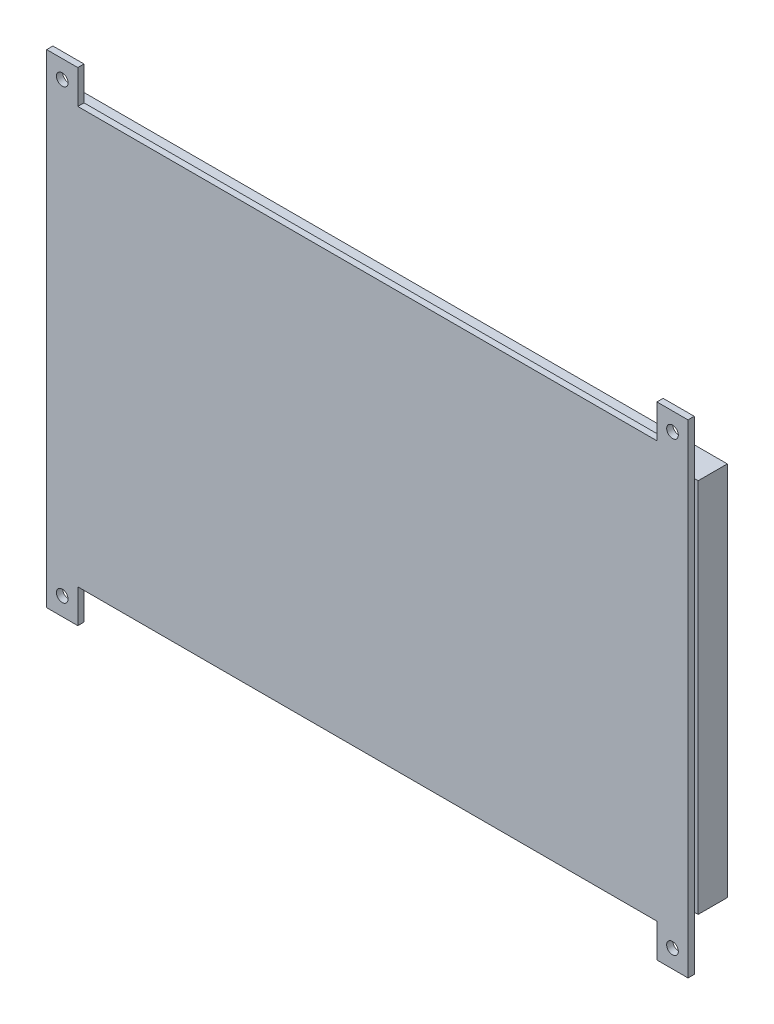
ISO-10303-21;
HEADER;
FILE_DESCRIPTION(('STEP AP214'),'2;1');
FILE_NAME('part.step','',(''),(''),'','','');
FILE_SCHEMA(('AUTOMOTIVE_DESIGN { 1 0 10303 214 1 1 1 1 }'));
ENDSEC;
DATA;
#1=APPLICATION_CONTEXT('core data for automotive mechanical design processes');
#2=APPLICATION_PROTOCOL_DEFINITION('international standard','automotive_design',2000,#1);
#3=PRODUCT_CONTEXT('',#1,'mechanical');
#4=PRODUCT('Part','Part','',(#3));
#5=PRODUCT_RELATED_PRODUCT_CATEGORY('part','',(#4));
#6=PRODUCT_DEFINITION_FORMATION('','',#4);
#7=PRODUCT_DEFINITION_CONTEXT('part definition',#1,'design');
#8=PRODUCT_DEFINITION('design','',#6,#7);
#9=PRODUCT_DEFINITION_SHAPE('','',#8);
#10=(LENGTH_UNIT() NAMED_UNIT(*) SI_UNIT(.MILLI.,.METRE.));
#11=(NAMED_UNIT(*) PLANE_ANGLE_UNIT() SI_UNIT($,.RADIAN.));
#12=(NAMED_UNIT(*) SI_UNIT($,.STERADIAN.) SOLID_ANGLE_UNIT());
#13=UNCERTAINTY_MEASURE_WITH_UNIT(LENGTH_MEASURE(1.E-05),#10,'distance_accuracy_value','');
#14=(GEOMETRIC_REPRESENTATION_CONTEXT(3) GLOBAL_UNCERTAINTY_ASSIGNED_CONTEXT((#13)) GLOBAL_UNIT_ASSIGNED_CONTEXT((#10,
#11,#12)) REPRESENTATION_CONTEXT('',''));
#15=CARTESIAN_POINT('',(0.,0.,0.));
#16=DIRECTION('',(0.,0.,1.));
#17=DIRECTION('',(1.,0.,0.));
#18=AXIS2_PLACEMENT_3D('',#15,#16,#17);
#19=CARTESIAN_POINT('',(-78.45,43.2869206573995,-7.5));
#20=DIRECTION('',(1.,0.,0.));
#21=DIRECTION('',(0.,1.,0.));
#22=AXIS2_PLACEMENT_3D('',#19,#20,#21);
#23=PLANE('',#22);
#24=DIRECTION('',(0.,0.,1.));
#25=VECTOR('',#24,1.);
#26=CARTESIAN_POINT('',(-78.45,43.2869206573995,-7.5));
#27=LINE('',#26,#25);
#28=CARTESIAN_POINT('',(-78.45,43.2869206573995,-7.5));
#29=VERTEX_POINT('',#28);
#30=CARTESIAN_POINT('',(-78.45,43.2869206573995,-4.));
#31=VERTEX_POINT('',#30);
#32=EDGE_CURVE('E195',#29,#31,#27,.T.);
#33=ORIENTED_EDGE('',*,*,#32,.T.);
#34=DIRECTION('',(0.,1.,0.));
#35=VECTOR('',#34,1.);
#36=CARTESIAN_POINT('',(-78.45,-43.2869206573995,-4.));
#37=LINE('',#36,#35);
#38=CARTESIAN_POINT('',(-78.45,-43.2869206573995,-4.));
#39=VERTEX_POINT('',#38);
#40=EDGE_CURVE('E181',#39,#31,#37,.T.);
#41=ORIENTED_EDGE('',*,*,#40,.F.);
#42=DIRECTION('',(0.,0.,1.));
#43=VECTOR('',#42,1.);
#44=CARTESIAN_POINT('',(-78.45,-43.2869206573995,-7.5));
#45=LINE('',#44,#43);
#46=CARTESIAN_POINT('',(-78.45,-43.2869206573995,-7.5));
#47=VERTEX_POINT('',#46);
#48=EDGE_CURVE('E624',#47,#39,#45,.T.);
#49=ORIENTED_EDGE('',*,*,#48,.F.);
#50=DIRECTION('',(0.,1.,0.));
#51=VECTOR('',#50,1.);
#52=CARTESIAN_POINT('',(-78.45,43.2869206573995,-7.5));
#53=LINE('',#52,#51);
#54=EDGE_CURVE('E201',#47,#29,#53,.T.);
#55=ORIENTED_EDGE('',*,*,#54,.T.);
#56=EDGE_LOOP('',(#33,#41,#49,#55));
#57=FACE_BOUND('',#56,.T.);
#58=ADVANCED_FACE('F32',(#57),#23,.T.);
#59=CARTESIAN_POINT('',(78.45,43.2869206573995,-7.5));
#60=DIRECTION('',(0.,-1.,0.));
#61=DIRECTION('',(0.,0.,-1.));
#62=AXIS2_PLACEMENT_3D('',#59,#60,#61);
#63=PLANE('',#62);
#64=DIRECTION('',(0.,0.,1.));
#65=VECTOR('',#64,1.);
#66=CARTESIAN_POINT('',(78.45,43.2869206573995,-7.5));
#67=LINE('',#66,#65);
#68=CARTESIAN_POINT('',(78.45,43.2869206573995,-7.5));
#69=VERTEX_POINT('',#68);
#70=CARTESIAN_POINT('',(78.45,43.2869206573995,-4.));
#71=VERTEX_POINT('',#70);
#72=EDGE_CURVE('E198',#69,#71,#67,.T.);
#73=ORIENTED_EDGE('',*,*,#72,.T.);
#74=DIRECTION('',(1.,0.,0.));
#75=VECTOR('',#74,1.);
#76=CARTESIAN_POINT('',(78.45,43.2869206573995,-4.));
#77=LINE('',#76,#75);
#78=EDGE_CURVE('E184',#31,#71,#77,.T.);
#79=ORIENTED_EDGE('',*,*,#78,.F.);
#80=ORIENTED_EDGE('',*,*,#32,.F.);
#81=DIRECTION('',(1.,0.,0.));
#82=VECTOR('',#81,1.);
#83=CARTESIAN_POINT('',(78.45,43.2869206573995,-7.5));
#84=LINE('',#83,#82);
#85=EDGE_CURVE('E630',#29,#69,#84,.T.);
#86=ORIENTED_EDGE('',*,*,#85,.T.);
#87=EDGE_LOOP('',(#73,#79,#80,#86));
#88=FACE_BOUND('',#87,.T.);
#89=ADVANCED_FACE('F194',(#88),#63,.T.);
#90=CARTESIAN_POINT('',(78.45,43.2869206573995,-7.5));
#91=DIRECTION('',(-1.,0.,0.));
#92=DIRECTION('',(0.,-1.,0.));
#93=AXIS2_PLACEMENT_3D('',#90,#91,#92);
#94=PLANE('',#93);
#95=DIRECTION('',(0.,0.,1.));
#96=VECTOR('',#95,1.);
#97=CARTESIAN_POINT('',(78.45,-43.2869206573995,-7.5));
#98=LINE('',#97,#96);
#99=CARTESIAN_POINT('',(78.45,-43.2869206573995,-7.5));
#100=VERTEX_POINT('',#99);
#101=CARTESIAN_POINT('',(78.45,-43.2869206573995,-4.));
#102=VERTEX_POINT('',#101);
#103=EDGE_CURVE('E207',#100,#102,#98,.T.);
#104=ORIENTED_EDGE('',*,*,#103,.T.);
#105=DIRECTION('',(0.,-1.,0.));
#106=VECTOR('',#105,1.);
#107=CARTESIAN_POINT('',(78.45,-43.2869206573995,-4.));
#108=LINE('',#107,#106);
#109=EDGE_CURVE('E51',#71,#102,#108,.T.);
#110=ORIENTED_EDGE('',*,*,#109,.F.);
#111=ORIENTED_EDGE('',*,*,#72,.F.);
#112=DIRECTION('',(0.,-1.,0.));
#113=VECTOR('',#112,1.);
#114=CARTESIAN_POINT('',(78.45,43.2869206573995,-7.5));
#115=LINE('',#114,#113);
#116=EDGE_CURVE('E622',#69,#100,#115,.T.);
#117=ORIENTED_EDGE('',*,*,#116,.T.);
#118=EDGE_LOOP('',(#104,#110,#111,#117));
#119=FACE_BOUND('',#118,.T.);
#120=ADVANCED_FACE('F441',(#119),#94,.T.);
#121=CARTESIAN_POINT('',(78.45,-43.2869206573995,-7.5));
#122=DIRECTION('',(0.,1.,0.));
#123=DIRECTION('',(0.,0.,1.));
#124=AXIS2_PLACEMENT_3D('',#121,#122,#123);
#125=PLANE('',#124);
#126=ORIENTED_EDGE('',*,*,#48,.T.);
#127=DIRECTION('',(-1.,0.,0.));
#128=VECTOR('',#127,1.);
#129=CARTESIAN_POINT('',(78.45,-43.2869206573995,-4.));
#130=LINE('',#129,#128);
#131=EDGE_CURVE('E185',#102,#39,#130,.T.);
#132=ORIENTED_EDGE('',*,*,#131,.F.);
#133=ORIENTED_EDGE('',*,*,#103,.F.);
#134=DIRECTION('',(-1.,0.,0.));
#135=VECTOR('',#134,1.);
#136=CARTESIAN_POINT('',(78.45,-43.2869206573995,-7.5));
#137=LINE('',#136,#135);
#138=EDGE_CURVE('E625',#100,#47,#137,.T.);
#139=ORIENTED_EDGE('',*,*,#138,.T.);
#140=EDGE_LOOP('',(#126,#132,#133,#139));
#141=FACE_BOUND('',#140,.T.);
#142=ADVANCED_FACE('F478',(#141),#125,.T.);
#143=CARTESIAN_POINT('',(0.,0.,0.));
#144=DIRECTION('',(0.,0.,1.));
#145=DIRECTION('',(1.,0.,0.));
#146=AXIS2_PLACEMENT_3D('',#143,#144,#145);
#147=PLANE('',#146);
#148=CARTESIAN_POINT('',(78.45,57.48,0.));
#149=DIRECTION('',(0.,0.,1.));
#150=DIRECTION('',(1.,0.,0.));
#151=AXIS2_PLACEMENT_3D('',#148,#149,#150);
#152=CIRCLE('',#151,1.5);
#153=CARTESIAN_POINT('',(79.95,57.48,0.));
#154=VERTEX_POINT('',#153);
#155=EDGE_CURVE('E254',#154,#154,#152,.T.);
#156=ORIENTED_EDGE('',*,*,#155,.T.);
#157=EDGE_LOOP('',(#156));
#158=FACE_BOUND('',#157,.T.);
#159=CARTESIAN_POINT('',(-78.45,57.48,0.));
#160=DIRECTION('',(0.,0.,1.));
#161=DIRECTION('',(1.,0.,0.));
#162=AXIS2_PLACEMENT_3D('',#159,#160,#161);
#163=CIRCLE('',#162,1.5);
#164=CARTESIAN_POINT('',(-76.95,57.48,0.));
#165=VERTEX_POINT('',#164);
#166=EDGE_CURVE('E248',#165,#165,#163,.T.);
#167=ORIENTED_EDGE('',*,*,#166,.T.);
#168=EDGE_LOOP('',(#167));
#169=FACE_BOUND('',#168,.T.);
#170=DIRECTION('',(1.,0.,0.));
#171=VECTOR('',#170,1.);
#172=CARTESIAN_POINT('',(83.45,48.2869206573995,0.));
#173=LINE('',#172,#171);
#174=CARTESIAN_POINT('',(-82.45,48.2869206573995,0.));
#175=VERTEX_POINT('',#174);
#176=CARTESIAN_POINT('',(82.45,48.2869206573995,0.));
#177=VERTEX_POINT('',#176);
#178=EDGE_CURVE('E11',#175,#177,#173,.T.);
#179=ORIENTED_EDGE('',*,*,#178,.F.);
#180=DIRECTION('',(0.,-1.,0.));
#181=VECTOR('',#180,1.);
#182=CARTESIAN_POINT('',(-82.45,-53.48,0.));
#183=LINE('',#182,#181);
#184=CARTESIAN_POINT('',(-82.45,62.135,0.));
#185=VERTEX_POINT('',#184);
#186=EDGE_CURVE('E302',#185,#175,#183,.T.);
#187=ORIENTED_EDGE('',*,*,#186,.F.);
#188=DIRECTION('',(-1.,0.,0.));
#189=VECTOR('',#188,1.);
#190=CARTESIAN_POINT('',(-82.45,62.135,0.));
#191=LINE('',#190,#189);
#192=CARTESIAN_POINT('',(-74.45,62.135,0.));
#193=VERTEX_POINT('',#192);
#194=EDGE_CURVE('E298',#193,#185,#191,.T.);
#195=ORIENTED_EDGE('',*,*,#194,.F.);
#196=DIRECTION('',(0.,1.,0.));
#197=VECTOR('',#196,1.);
#198=CARTESIAN_POINT('',(-74.45,53.48,0.));
#199=LINE('',#198,#197);
#200=CARTESIAN_POINT('',(-74.45,53.48,0.));
#201=VERTEX_POINT('',#200);
#202=EDGE_CURVE('E296',#201,#193,#199,.T.);
#203=ORIENTED_EDGE('',*,*,#202,.F.);
#204=DIRECTION('',(-1.,0.,0.));
#205=VECTOR('',#204,1.);
#206=CARTESIAN_POINT('',(-74.45,53.48,0.));
#207=LINE('',#206,#205);
#208=CARTESIAN_POINT('',(74.45,53.48,0.));
#209=VERTEX_POINT('',#208);
#210=EDGE_CURVE('E294',#209,#201,#207,.T.);
#211=ORIENTED_EDGE('',*,*,#210,.F.);
#212=DIRECTION('',(0.,-1.,0.));
#213=VECTOR('',#212,1.);
#214=CARTESIAN_POINT('',(74.45,53.48,0.));
#215=LINE('',#214,#213);
#216=CARTESIAN_POINT('',(74.45,62.135,0.));
#217=VERTEX_POINT('',#216);
#218=EDGE_CURVE('E292',#217,#209,#215,.T.);
#219=ORIENTED_EDGE('',*,*,#218,.F.);
#220=DIRECTION('',(-1.,0.,0.));
#221=VECTOR('',#220,1.);
#222=CARTESIAN_POINT('',(82.45,62.135,0.));
#223=LINE('',#222,#221);
#224=CARTESIAN_POINT('',(82.45,62.135,0.));
#225=VERTEX_POINT('',#224);
#226=EDGE_CURVE('E260',#225,#217,#223,.T.);
#227=ORIENTED_EDGE('',*,*,#226,.F.);
#228=DIRECTION('',(0.,1.,0.));
#229=VECTOR('',#228,1.);
#230=CARTESIAN_POINT('',(82.45,-53.48,0.));
#231=LINE('',#230,#229);
#232=EDGE_CURVE('E316',#177,#225,#231,.T.);
#233=ORIENTED_EDGE('',*,*,#232,.F.);
#234=EDGE_LOOP('',(#179,#187,#195,#203,#211,#219,#227,#233));
#235=FACE_BOUND('',#234,.T.);
#236=ADVANCED_FACE('F391',(#158,#169,#235),#147,.F.);
#237=CARTESIAN_POINT('',(-78.45,-57.48,0.));
#238=DIRECTION('',(0.,0.,1.));
#239=DIRECTION('',(-1.,0.,0.));
#240=AXIS2_PLACEMENT_3D('',#237,#238,#239);
#241=CIRCLE('',#240,1.5);
#242=CARTESIAN_POINT('',(-79.95,-57.48,0.));
#243=VERTEX_POINT('',#242);
#244=EDGE_CURVE('E242',#243,#243,#241,.T.);
#245=ORIENTED_EDGE('',*,*,#244,.T.);
#246=EDGE_LOOP('',(#245));
#247=FACE_BOUND('',#246,.T.);
#248=CARTESIAN_POINT('',(78.45,-57.48,0.));
#249=DIRECTION('',(0.,0.,1.));
#250=DIRECTION('',(-1.,0.,0.));
#251=AXIS2_PLACEMENT_3D('',#248,#249,#250);
#252=CIRCLE('',#251,1.5);
#253=CARTESIAN_POINT('',(76.95,-57.48,0.));
#254=VERTEX_POINT('',#253);
#255=EDGE_CURVE('E238',#254,#254,#252,.T.);
#256=ORIENTED_EDGE('',*,*,#255,.T.);
#257=EDGE_LOOP('',(#256));
#258=FACE_BOUND('',#257,.T.);
#259=DIRECTION('',(-1.,0.,0.));
#260=VECTOR('',#259,1.);
#261=CARTESIAN_POINT('',(83.45,-48.2869206573995,0.));
#262=LINE('',#261,#260);
#263=CARTESIAN_POINT('',(82.45,-48.2869206573995,0.));
#264=VERTEX_POINT('',#263);
#265=CARTESIAN_POINT('',(-82.45,-48.2869206573995,0.));
#266=VERTEX_POINT('',#265);
#267=EDGE_CURVE('E41',#264,#266,#262,.T.);
#268=ORIENTED_EDGE('',*,*,#267,.F.);
#269=CARTESIAN_POINT('',(82.45,-62.135,0.));
#270=VERTEX_POINT('',#269);
#271=EDGE_CURVE('E267',#270,#264,#231,.T.);
#272=ORIENTED_EDGE('',*,*,#271,.F.);
#273=DIRECTION('',(1.,0.,0.));
#274=VECTOR('',#273,1.);
#275=CARTESIAN_POINT('',(82.45,-62.135,0.));
#276=LINE('',#275,#274);
#277=CARTESIAN_POINT('',(74.45,-62.135,0.));
#278=VERTEX_POINT('',#277);
#279=EDGE_CURVE('E313',#278,#270,#276,.T.);
#280=ORIENTED_EDGE('',*,*,#279,.F.);
#281=DIRECTION('',(0.,-1.,0.));
#282=VECTOR('',#281,1.);
#283=CARTESIAN_POINT('',(74.45,-53.48,0.));
#284=LINE('',#283,#282);
#285=CARTESIAN_POINT('',(74.45,-53.48,0.));
#286=VERTEX_POINT('',#285);
#287=EDGE_CURVE('E311',#286,#278,#284,.T.);
#288=ORIENTED_EDGE('',*,*,#287,.F.);
#289=DIRECTION('',(1.,0.,0.));
#290=VECTOR('',#289,1.);
#291=CARTESIAN_POINT('',(-74.45,-53.48,0.));
#292=LINE('',#291,#290);
#293=CARTESIAN_POINT('',(-74.45,-53.48,0.));
#294=VERTEX_POINT('',#293);
#295=EDGE_CURVE('E309',#294,#286,#292,.T.);
#296=ORIENTED_EDGE('',*,*,#295,.F.);
#297=DIRECTION('',(0.,1.,0.));
#298=VECTOR('',#297,1.);
#299=CARTESIAN_POINT('',(-74.45,-53.48,0.));
#300=LINE('',#299,#298);
#301=CARTESIAN_POINT('',(-74.45,-62.135,0.));
#302=VERTEX_POINT('',#301);
#303=EDGE_CURVE('E307',#302,#294,#300,.T.);
#304=ORIENTED_EDGE('',*,*,#303,.F.);
#305=DIRECTION('',(1.,0.,0.));
#306=VECTOR('',#305,1.);
#307=CARTESIAN_POINT('',(-82.45,-62.135,0.));
#308=LINE('',#307,#306);
#309=CARTESIAN_POINT('',(-82.45,-62.135,0.));
#310=VERTEX_POINT('',#309);
#311=EDGE_CURVE('E304',#310,#302,#308,.T.);
#312=ORIENTED_EDGE('',*,*,#311,.F.);
#313=EDGE_CURVE('E301',#266,#310,#183,.T.);
#314=ORIENTED_EDGE('',*,*,#313,.F.);
#315=EDGE_LOOP('',(#268,#272,#280,#288,#296,#304,#312,#314));
#316=FACE_BOUND('',#315,.T.);
#317=ADVANCED_FACE('F408',(#247,#258,#316),#147,.F.);
#318=CARTESIAN_POINT('',(0.,0.,1.6));
#319=DIRECTION('',(0.,0.,1.));
#320=DIRECTION('',(1.,0.,0.));
#321=AXIS2_PLACEMENT_3D('',#318,#319,#320);
#322=PLANE('',#321);
#323=CARTESIAN_POINT('',(-78.45,-57.48,1.6));
#324=DIRECTION('',(0.,0.,1.));
#325=DIRECTION('',(-1.,0.,0.));
#326=AXIS2_PLACEMENT_3D('',#323,#324,#325);
#327=CIRCLE('',#326,1.5);
#328=CARTESIAN_POINT('',(-79.95,-57.48,1.6));
#329=VERTEX_POINT('',#328);
#330=EDGE_CURVE('E245',#329,#329,#327,.T.);
#331=ORIENTED_EDGE('',*,*,#330,.F.);
#332=EDGE_LOOP('',(#331));
#333=FACE_BOUND('',#332,.T.);
#334=CARTESIAN_POINT('',(78.45,57.48,1.6));
#335=DIRECTION('',(0.,0.,1.));
#336=DIRECTION('',(1.,0.,0.));
#337=AXIS2_PLACEMENT_3D('',#334,#335,#336);
#338=CIRCLE('',#337,1.5);
#339=CARTESIAN_POINT('',(79.95,57.48,1.6));
#340=VERTEX_POINT('',#339);
#341=EDGE_CURVE('E257',#340,#340,#338,.T.);
#342=ORIENTED_EDGE('',*,*,#341,.F.);
#343=EDGE_LOOP('',(#342));
#344=FACE_BOUND('',#343,.T.);
#345=DIRECTION('',(0.,1.,0.));
#346=VECTOR('',#345,1.);
#347=CARTESIAN_POINT('',(82.45,53.48,1.6));
#348=LINE('',#347,#346);
#349=CARTESIAN_POINT('',(82.45,-62.135,1.6));
#350=VERTEX_POINT('',#349);
#351=CARTESIAN_POINT('',(82.45,62.135,1.6));
#352=VERTEX_POINT('',#351);
#353=EDGE_CURVE('E263',#350,#352,#348,.T.);
#354=ORIENTED_EDGE('',*,*,#353,.T.);
#355=DIRECTION('',(-1.,0.,0.));
#356=VECTOR('',#355,1.);
#357=CARTESIAN_POINT('',(82.45,62.135,1.6));
#358=LINE('',#357,#356);
#359=CARTESIAN_POINT('',(74.45,62.135,1.6));
#360=VERTEX_POINT('',#359);
#361=EDGE_CURVE('E266',#352,#360,#358,.T.);
#362=ORIENTED_EDGE('',*,*,#361,.T.);
#363=DIRECTION('',(0.,-1.,0.));
#364=VECTOR('',#363,1.);
#365=CARTESIAN_POINT('',(74.45,53.48,1.6));
#366=LINE('',#365,#364);
#367=CARTESIAN_POINT('',(74.45,53.48,1.6));
#368=VERTEX_POINT('',#367);
#369=EDGE_CURVE('E269',#360,#368,#366,.T.);
#370=ORIENTED_EDGE('',*,*,#369,.T.);
#371=DIRECTION('',(-1.,0.,0.));
#372=VECTOR('',#371,1.);
#373=CARTESIAN_POINT('',(-74.45,53.48,1.6));
#374=LINE('',#373,#372);
#375=CARTESIAN_POINT('',(-74.45,53.48,1.6));
#376=VERTEX_POINT('',#375);
#377=EDGE_CURVE('E271',#368,#376,#374,.T.);
#378=ORIENTED_EDGE('',*,*,#377,.T.);
#379=DIRECTION('',(0.,1.,0.));
#380=VECTOR('',#379,1.);
#381=CARTESIAN_POINT('',(-74.45,53.48,1.6));
#382=LINE('',#381,#380);
#383=CARTESIAN_POINT('',(-74.45,62.135,1.6));
#384=VERTEX_POINT('',#383);
#385=EDGE_CURVE('E273',#376,#384,#382,.T.);
#386=ORIENTED_EDGE('',*,*,#385,.T.);
#387=DIRECTION('',(-1.,0.,0.));
#388=VECTOR('',#387,1.);
#389=CARTESIAN_POINT('',(-82.45,62.135,1.6));
#390=LINE('',#389,#388);
#391=CARTESIAN_POINT('',(-82.45,62.135,1.6));
#392=VERTEX_POINT('',#391);
#393=EDGE_CURVE('E275',#384,#392,#390,.T.);
#394=ORIENTED_EDGE('',*,*,#393,.T.);
#395=DIRECTION('',(0.,-1.,0.));
#396=VECTOR('',#395,1.);
#397=CARTESIAN_POINT('',(-82.45,53.48,1.6));
#398=LINE('',#397,#396);
#399=CARTESIAN_POINT('',(-82.45,-62.135,1.6));
#400=VERTEX_POINT('',#399);
#401=EDGE_CURVE('E277',#392,#400,#398,.T.);
#402=ORIENTED_EDGE('',*,*,#401,.T.);
#403=DIRECTION('',(1.,0.,0.));
#404=VECTOR('',#403,1.);
#405=CARTESIAN_POINT('',(-82.45,-62.135,1.6));
#406=LINE('',#405,#404);
#407=CARTESIAN_POINT('',(-74.45,-62.135,1.6));
#408=VERTEX_POINT('',#407);
#409=EDGE_CURVE('E279',#400,#408,#406,.T.);
#410=ORIENTED_EDGE('',*,*,#409,.T.);
#411=DIRECTION('',(0.,1.,0.));
#412=VECTOR('',#411,1.);
#413=CARTESIAN_POINT('',(-74.45,-53.48,1.6));
#414=LINE('',#413,#412);
#415=CARTESIAN_POINT('',(-74.45,-53.48,1.6));
#416=VERTEX_POINT('',#415);
#417=EDGE_CURVE('E281',#408,#416,#414,.T.);
#418=ORIENTED_EDGE('',*,*,#417,.T.);
#419=DIRECTION('',(1.,0.,0.));
#420=VECTOR('',#419,1.);
#421=CARTESIAN_POINT('',(-74.45,-53.48,1.6));
#422=LINE('',#421,#420);
#423=CARTESIAN_POINT('',(74.45,-53.48,1.6));
#424=VERTEX_POINT('',#423);
#425=EDGE_CURVE('E283',#416,#424,#422,.T.);
#426=ORIENTED_EDGE('',*,*,#425,.T.);
#427=DIRECTION('',(0.,-1.,0.));
#428=VECTOR('',#427,1.);
#429=CARTESIAN_POINT('',(74.45,-53.48,1.6));
#430=LINE('',#429,#428);
#431=CARTESIAN_POINT('',(74.45,-62.135,1.6));
#432=VERTEX_POINT('',#431);
#433=EDGE_CURVE('E285',#424,#432,#430,.T.);
#434=ORIENTED_EDGE('',*,*,#433,.T.);
#435=DIRECTION('',(1.,0.,0.));
#436=VECTOR('',#435,1.);
#437=CARTESIAN_POINT('',(82.45,-62.135,1.6));
#438=LINE('',#437,#436);
#439=EDGE_CURVE('E287',#432,#350,#438,.T.);
#440=ORIENTED_EDGE('',*,*,#439,.T.);
#441=EDGE_LOOP('',(#354,#362,#370,#378,#386,#394,#402,#410,#418,#426,#434,#440));
#442=FACE_BOUND('',#441,.T.);
#443=CARTESIAN_POINT('',(-78.45,57.48,1.6));
#444=DIRECTION('',(0.,0.,1.));
#445=DIRECTION('',(1.,0.,0.));
#446=AXIS2_PLACEMENT_3D('',#443,#444,#445);
#447=CIRCLE('',#446,1.5);
#448=CARTESIAN_POINT('',(-76.95,57.48,1.6));
#449=VERTEX_POINT('',#448);
#450=EDGE_CURVE('E251',#449,#449,#447,.T.);
#451=ORIENTED_EDGE('',*,*,#450,.F.);
#452=EDGE_LOOP('',(#451));
#453=FACE_BOUND('',#452,.T.);
#454=CARTESIAN_POINT('',(78.45,-57.48,1.6));
#455=DIRECTION('',(0.,0.,1.));
#456=DIRECTION('',(-1.,0.,0.));
#457=AXIS2_PLACEMENT_3D('',#454,#455,#456);
#458=CIRCLE('',#457,1.5);
#459=CARTESIAN_POINT('',(76.95,-57.48,1.6));
#460=VERTEX_POINT('',#459);
#461=EDGE_CURVE('E239',#460,#460,#458,.T.);
#462=ORIENTED_EDGE('',*,*,#461,.F.);
#463=EDGE_LOOP('',(#462));
#464=FACE_BOUND('',#463,.T.);
#465=ADVANCED_FACE('F397',(#333,#344,#442,#453,#464),#322,.T.);
#466=CARTESIAN_POINT('',(82.45,62.135,1.6));
#467=DIRECTION('',(0.,-1.,0.));
#468=DIRECTION('',(1.,0.,0.));
#469=AXIS2_PLACEMENT_3D('',#466,#467,#468);
#470=PLANE('',#469);
#471=ORIENTED_EDGE('',*,*,#226,.T.);
#472=DIRECTION('',(0.,0.,-1.));
#473=VECTOR('',#472,1.);
#474=CARTESIAN_POINT('',(74.45,62.135,1.6));
#475=LINE('',#474,#473);
#476=EDGE_CURVE('E348',#360,#217,#475,.T.);
#477=ORIENTED_EDGE('',*,*,#476,.F.);
#478=ORIENTED_EDGE('',*,*,#361,.F.);
#479=DIRECTION('',(0.,0.,-1.));
#480=VECTOR('',#479,1.);
#481=CARTESIAN_POINT('',(82.45,62.135,1.6));
#482=LINE('',#481,#480);
#483=EDGE_CURVE('E36',#352,#225,#482,.T.);
#484=ORIENTED_EDGE('',*,*,#483,.T.);
#485=EDGE_LOOP('',(#471,#477,#478,#484));
#486=FACE_BOUND('',#485,.T.);
#487=ADVANCED_FACE('F34',(#486),#470,.F.);
#488=CARTESIAN_POINT('',(74.45,53.48,1.6));
#489=DIRECTION('',(1.,0.,0.));
#490=DIRECTION('',(0.,1.,0.));
#491=AXIS2_PLACEMENT_3D('',#488,#489,#490);
#492=PLANE('',#491);
#493=ORIENTED_EDGE('',*,*,#218,.T.);
#494=DIRECTION('',(0.,0.,-1.));
#495=VECTOR('',#494,1.);
#496=CARTESIAN_POINT('',(74.45,53.48,1.6));
#497=LINE('',#496,#495);
#498=EDGE_CURVE('E346',#368,#209,#497,.T.);
#499=ORIENTED_EDGE('',*,*,#498,.F.);
#500=ORIENTED_EDGE('',*,*,#369,.F.);
#501=ORIENTED_EDGE('',*,*,#476,.T.);
#502=EDGE_LOOP('',(#493,#499,#500,#501));
#503=FACE_BOUND('',#502,.T.);
#504=ADVANCED_FACE('F394',(#503),#492,.F.);
#505=CARTESIAN_POINT('',(-74.45,53.48,1.6));
#506=DIRECTION('',(0.,-1.,0.));
#507=DIRECTION('',(1.,0.,0.));
#508=AXIS2_PLACEMENT_3D('',#505,#506,#507);
#509=PLANE('',#508);
#510=ORIENTED_EDGE('',*,*,#210,.T.);
#511=DIRECTION('',(0.,0.,-1.));
#512=VECTOR('',#511,1.);
#513=CARTESIAN_POINT('',(-74.45,53.48,1.6));
#514=LINE('',#513,#512);
#515=EDGE_CURVE('E343',#376,#201,#514,.T.);
#516=ORIENTED_EDGE('',*,*,#515,.F.);
#517=ORIENTED_EDGE('',*,*,#377,.F.);
#518=ORIENTED_EDGE('',*,*,#498,.T.);
#519=EDGE_LOOP('',(#510,#516,#517,#518));
#520=FACE_BOUND('',#519,.T.);
#521=ADVANCED_FACE('F428',(#520),#509,.F.);
#522=CARTESIAN_POINT('',(-74.45,53.48,1.6));
#523=DIRECTION('',(-1.,0.,0.));
#524=DIRECTION('',(0.,-1.,0.));
#525=AXIS2_PLACEMENT_3D('',#522,#523,#524);
#526=PLANE('',#525);
#527=ORIENTED_EDGE('',*,*,#202,.T.);
#528=DIRECTION('',(0.,0.,-1.));
#529=VECTOR('',#528,1.);
#530=CARTESIAN_POINT('',(-74.45,62.135,1.6));
#531=LINE('',#530,#529);
#532=EDGE_CURVE('E340',#384,#193,#531,.T.);
#533=ORIENTED_EDGE('',*,*,#532,.F.);
#534=ORIENTED_EDGE('',*,*,#385,.F.);
#535=ORIENTED_EDGE('',*,*,#515,.T.);
#536=EDGE_LOOP('',(#527,#533,#534,#535));
#537=FACE_BOUND('',#536,.T.);
#538=ADVANCED_FACE('F426',(#537),#526,.F.);
#539=CARTESIAN_POINT('',(-82.45,62.135,1.6));
#540=DIRECTION('',(0.,-1.,0.));
#541=DIRECTION('',(1.,0.,0.));
#542=AXIS2_PLACEMENT_3D('',#539,#540,#541);
#543=PLANE('',#542);
#544=ORIENTED_EDGE('',*,*,#194,.T.);
#545=DIRECTION('',(0.,0.,-1.));
#546=VECTOR('',#545,1.);
#547=CARTESIAN_POINT('',(-82.45,62.135,1.6));
#548=LINE('',#547,#546);
#549=EDGE_CURVE('E337',#392,#185,#548,.T.);
#550=ORIENTED_EDGE('',*,*,#549,.F.);
#551=ORIENTED_EDGE('',*,*,#393,.F.);
#552=ORIENTED_EDGE('',*,*,#532,.T.);
#553=EDGE_LOOP('',(#544,#550,#551,#552));
#554=FACE_BOUND('',#553,.T.);
#555=ADVANCED_FACE('F421',(#554),#543,.F.);
#556=CARTESIAN_POINT('',(-82.45,-53.48,1.6));
#557=DIRECTION('',(1.,0.,0.));
#558=DIRECTION('',(0.,0.,-1.));
#559=AXIS2_PLACEMENT_3D('',#556,#557,#558);
#560=PLANE('',#559);
#561=ORIENTED_EDGE('',*,*,#186,.T.);
#562=EDGE_CURVE('E305',#175,#266,#183,.T.);
#563=ORIENTED_EDGE('',*,*,#562,.T.);
#564=ORIENTED_EDGE('',*,*,#313,.T.);
#565=DIRECTION('',(0.,0.,-1.));
#566=VECTOR('',#565,1.);
#567=CARTESIAN_POINT('',(-82.45,-62.135,1.6));
#568=LINE('',#567,#566);
#569=EDGE_CURVE('E334',#400,#310,#568,.T.);
#570=ORIENTED_EDGE('',*,*,#569,.F.);
#571=ORIENTED_EDGE('',*,*,#401,.F.);
#572=ORIENTED_EDGE('',*,*,#549,.T.);
#573=EDGE_LOOP('',(#561,#563,#564,#570,#571,#572));
#574=FACE_BOUND('',#573,.T.);
#575=ADVANCED_FACE('F415',(#574),#560,.F.);
#576=CARTESIAN_POINT('',(-82.45,-62.135,1.6));
#577=DIRECTION('',(0.,1.,0.));
#578=DIRECTION('',(-1.,0.,0.));
#579=AXIS2_PLACEMENT_3D('',#576,#577,#578);
#580=PLANE('',#579);
#581=ORIENTED_EDGE('',*,*,#311,.T.);
#582=DIRECTION('',(0.,0.,-1.));
#583=VECTOR('',#582,1.);
#584=CARTESIAN_POINT('',(-74.45,-62.135,1.6));
#585=LINE('',#584,#583);
#586=EDGE_CURVE('E331',#408,#302,#585,.T.);
#587=ORIENTED_EDGE('',*,*,#586,.F.);
#588=ORIENTED_EDGE('',*,*,#409,.F.);
#589=ORIENTED_EDGE('',*,*,#569,.T.);
#590=EDGE_LOOP('',(#581,#587,#588,#589));
#591=FACE_BOUND('',#590,.T.);
#592=ADVANCED_FACE('F495',(#591),#580,.F.);
#593=CARTESIAN_POINT('',(-74.45,-53.48,1.6));
#594=DIRECTION('',(-1.,0.,0.));
#595=DIRECTION('',(0.,-1.,0.));
#596=AXIS2_PLACEMENT_3D('',#593,#594,#595);
#597=PLANE('',#596);
#598=ORIENTED_EDGE('',*,*,#303,.T.);
#599=DIRECTION('',(0.,0.,-1.));
#600=VECTOR('',#599,1.);
#601=CARTESIAN_POINT('',(-74.45,-53.48,1.6));
#602=LINE('',#601,#600);
#603=EDGE_CURVE('E328',#416,#294,#602,.T.);
#604=ORIENTED_EDGE('',*,*,#603,.F.);
#605=ORIENTED_EDGE('',*,*,#417,.F.);
#606=ORIENTED_EDGE('',*,*,#586,.T.);
#607=EDGE_LOOP('',(#598,#604,#605,#606));
#608=FACE_BOUND('',#607,.T.);
#609=ADVANCED_FACE('F491',(#608),#597,.F.);
#610=CARTESIAN_POINT('',(-74.45,-53.48,1.6));
#611=DIRECTION('',(0.,1.,0.));
#612=DIRECTION('',(-1.,0.,0.));
#613=AXIS2_PLACEMENT_3D('',#610,#611,#612);
#614=PLANE('',#613);
#615=ORIENTED_EDGE('',*,*,#295,.T.);
#616=DIRECTION('',(0.,0.,-1.));
#617=VECTOR('',#616,1.);
#618=CARTESIAN_POINT('',(74.45,-53.48,1.6));
#619=LINE('',#618,#617);
#620=EDGE_CURVE('E325',#424,#286,#619,.T.);
#621=ORIENTED_EDGE('',*,*,#620,.F.);
#622=ORIENTED_EDGE('',*,*,#425,.F.);
#623=ORIENTED_EDGE('',*,*,#603,.T.);
#624=EDGE_LOOP('',(#615,#621,#622,#623));
#625=FACE_BOUND('',#624,.T.);
#626=ADVANCED_FACE('F487',(#625),#614,.F.);
#627=CARTESIAN_POINT('',(74.45,-53.48,1.6));
#628=DIRECTION('',(1.,0.,0.));
#629=DIRECTION('',(0.,1.,0.));
#630=AXIS2_PLACEMENT_3D('',#627,#628,#629);
#631=PLANE('',#630);
#632=ORIENTED_EDGE('',*,*,#287,.T.);
#633=DIRECTION('',(0.,0.,-1.));
#634=VECTOR('',#633,1.);
#635=CARTESIAN_POINT('',(74.45,-62.135,1.6));
#636=LINE('',#635,#634);
#637=EDGE_CURVE('E322',#432,#278,#636,.T.);
#638=ORIENTED_EDGE('',*,*,#637,.F.);
#639=ORIENTED_EDGE('',*,*,#433,.F.);
#640=ORIENTED_EDGE('',*,*,#620,.T.);
#641=EDGE_LOOP('',(#632,#638,#639,#640));
#642=FACE_BOUND('',#641,.T.);
#643=ADVANCED_FACE('F484',(#642),#631,.F.);
#644=CARTESIAN_POINT('',(82.45,-62.135,1.6));
#645=DIRECTION('',(0.,1.,0.));
#646=DIRECTION('',(-1.,0.,0.));
#647=AXIS2_PLACEMENT_3D('',#644,#645,#646);
#648=PLANE('',#647);
#649=ORIENTED_EDGE('',*,*,#279,.T.);
#650=DIRECTION('',(0.,0.,-1.));
#651=VECTOR('',#650,1.);
#652=CARTESIAN_POINT('',(82.45,-62.135,1.6));
#653=LINE('',#652,#651);
#654=EDGE_CURVE('E290',#350,#270,#653,.T.);
#655=ORIENTED_EDGE('',*,*,#654,.F.);
#656=ORIENTED_EDGE('',*,*,#439,.F.);
#657=ORIENTED_EDGE('',*,*,#637,.T.);
#658=EDGE_LOOP('',(#649,#655,#656,#657));
#659=FACE_BOUND('',#658,.T.);
#660=ADVANCED_FACE('F403',(#659),#648,.F.);
#661=CARTESIAN_POINT('',(82.45,-53.48,1.6));
#662=DIRECTION('',(-1.,0.,0.));
#663=DIRECTION('',(0.,0.,1.));
#664=AXIS2_PLACEMENT_3D('',#661,#662,#663);
#665=PLANE('',#664);
#666=ORIENTED_EDGE('',*,*,#271,.T.);
#667=EDGE_CURVE('E319',#264,#177,#231,.T.);
#668=ORIENTED_EDGE('',*,*,#667,.T.);
#669=ORIENTED_EDGE('',*,*,#232,.T.);
#670=ORIENTED_EDGE('',*,*,#483,.F.);
#671=ORIENTED_EDGE('',*,*,#353,.F.);
#672=ORIENTED_EDGE('',*,*,#654,.T.);
#673=EDGE_LOOP('',(#666,#668,#669,#670,#671,#672));
#674=FACE_BOUND('',#673,.T.);
#675=ADVANCED_FACE('F390',(#674),#665,.F.);
#676=CARTESIAN_POINT('',(78.45,57.48,1.6));
#677=DIRECTION('',(0.,0.,-1.));
#678=DIRECTION('',(-1.,0.,0.));
#679=AXIS2_PLACEMENT_3D('',#676,#677,#678);
#680=CYLINDRICAL_SURFACE('',#679,1.5);
#681=ORIENTED_EDGE('',*,*,#341,.T.);
#682=EDGE_LOOP('',(#681));
#683=FACE_BOUND('',#682,.T.);
#684=ORIENTED_EDGE('',*,*,#155,.F.);
#685=EDGE_LOOP('',(#684));
#686=FACE_BOUND('',#685,.T.);
#687=ADVANCED_FACE('F468',(#683,#686),#680,.F.);
#688=CARTESIAN_POINT('',(-78.45,57.48,1.6));
#689=DIRECTION('',(0.,0.,-1.));
#690=DIRECTION('',(-1.,0.,0.));
#691=AXIS2_PLACEMENT_3D('',#688,#689,#690);
#692=CYLINDRICAL_SURFACE('',#691,1.5);
#693=ORIENTED_EDGE('',*,*,#450,.T.);
#694=EDGE_LOOP('',(#693));
#695=FACE_BOUND('',#694,.T.);
#696=ORIENTED_EDGE('',*,*,#166,.F.);
#697=EDGE_LOOP('',(#696));
#698=FACE_BOUND('',#697,.T.);
#699=ADVANCED_FACE('F464',(#695,#698),#692,.F.);
#700=CARTESIAN_POINT('',(-78.45,-57.48,1.6));
#701=DIRECTION('',(0.,0.,-1.));
#702=DIRECTION('',(-1.,0.,0.));
#703=AXIS2_PLACEMENT_3D('',#700,#701,#702);
#704=CYLINDRICAL_SURFACE('',#703,1.5);
#705=ORIENTED_EDGE('',*,*,#330,.T.);
#706=EDGE_LOOP('',(#705));
#707=FACE_BOUND('',#706,.T.);
#708=ORIENTED_EDGE('',*,*,#244,.F.);
#709=EDGE_LOOP('',(#708));
#710=FACE_BOUND('',#709,.T.);
#711=ADVANCED_FACE('F460',(#707,#710),#704,.F.);
#712=CARTESIAN_POINT('',(78.45,-57.48,1.6));
#713=DIRECTION('',(0.,0.,-1.));
#714=DIRECTION('',(-1.,0.,0.));
#715=AXIS2_PLACEMENT_3D('',#712,#713,#714);
#716=CYLINDRICAL_SURFACE('',#715,1.5);
#717=ORIENTED_EDGE('',*,*,#461,.T.);
#718=EDGE_LOOP('',(#717));
#719=FACE_BOUND('',#718,.T.);
#720=ORIENTED_EDGE('',*,*,#255,.F.);
#721=EDGE_LOOP('',(#720));
#722=FACE_BOUND('',#721,.T.);
#723=ADVANCED_FACE('F457',(#719,#722),#716,.F.);
#724=CARTESIAN_POINT('',(0.,0.,0.));
#725=DIRECTION('',(0.,0.,-1.));
#726=DIRECTION('',(-1.,0.,0.));
#727=AXIS2_PLACEMENT_3D('',#724,#725,#726);
#728=PLANE('',#727);
#729=ORIENTED_EDGE('',*,*,#667,.F.);
#730=CARTESIAN_POINT('',(83.45,-48.2869206573995,0.));
#731=VERTEX_POINT('',#730);
#732=EDGE_CURVE('E221',#731,#264,#262,.T.);
#733=ORIENTED_EDGE('',*,*,#732,.F.);
#734=DIRECTION('',(0.,-1.,0.));
#735=VECTOR('',#734,1.);
#736=CARTESIAN_POINT('',(83.45,48.2869206573995,0.));
#737=LINE('',#736,#735);
#738=CARTESIAN_POINT('',(83.45,48.2869206573995,0.));
#739=VERTEX_POINT('',#738);
#740=EDGE_CURVE('E202',#739,#731,#737,.T.);
#741=ORIENTED_EDGE('',*,*,#740,.F.);
#742=EDGE_CURVE('E44',#177,#739,#173,.T.);
#743=ORIENTED_EDGE('',*,*,#742,.F.);
#744=EDGE_LOOP('',(#729,#733,#741,#743));
#745=FACE_BOUND('',#744,.T.);
#746=ADVANCED_FACE('F386',(#745),#728,.F.);
#747=CARTESIAN_POINT('',(0.,0.,-7.5));
#748=DIRECTION('',(0.,0.,-1.));
#749=DIRECTION('',(-1.,0.,0.));
#750=AXIS2_PLACEMENT_3D('',#747,#748,#749);
#751=PLANE('',#750);
#752=DIRECTION('',(0.,-1.,0.));
#753=VECTOR('',#752,1.);
#754=CARTESIAN_POINT('',(83.45,48.2869206573995,-7.5));
#755=LINE('',#754,#753);
#756=CARTESIAN_POINT('',(83.45,48.2869206573995,-7.5));
#757=VERTEX_POINT('',#756);
#758=CARTESIAN_POINT('',(83.45,-48.2869206573995,-7.5));
#759=VERTEX_POINT('',#758);
#760=EDGE_CURVE('E211',#757,#759,#755,.T.);
#761=ORIENTED_EDGE('',*,*,#760,.T.);
#762=DIRECTION('',(-1.,0.,0.));
#763=VECTOR('',#762,1.);
#764=CARTESIAN_POINT('',(83.45,-48.2869206573995,-7.5));
#765=LINE('',#764,#763);
#766=CARTESIAN_POINT('',(-83.45,-48.2869206573995,-7.5));
#767=VERTEX_POINT('',#766);
#768=EDGE_CURVE('E214',#759,#767,#765,.T.);
#769=ORIENTED_EDGE('',*,*,#768,.T.);
#770=DIRECTION('',(0.,1.,0.));
#771=VECTOR('',#770,1.);
#772=CARTESIAN_POINT('',(-83.45,48.2869206573995,-7.5));
#773=LINE('',#772,#771);
#774=CARTESIAN_POINT('',(-83.45,48.2869206573995,-7.5));
#775=VERTEX_POINT('',#774);
#776=EDGE_CURVE('E216',#767,#775,#773,.T.);
#777=ORIENTED_EDGE('',*,*,#776,.T.);
#778=DIRECTION('',(1.,0.,0.));
#779=VECTOR('',#778,1.);
#780=CARTESIAN_POINT('',(83.45,48.2869206573995,-7.5));
#781=LINE('',#780,#779);
#782=EDGE_CURVE('E218',#775,#757,#781,.T.);
#783=ORIENTED_EDGE('',*,*,#782,.T.);
#784=EDGE_LOOP('',(#761,#769,#777,#783));
#785=FACE_BOUND('',#784,.T.);
#786=ORIENTED_EDGE('',*,*,#85,.F.);
#787=ORIENTED_EDGE('',*,*,#54,.F.);
#788=ORIENTED_EDGE('',*,*,#138,.F.);
#789=ORIENTED_EDGE('',*,*,#116,.F.);
#790=EDGE_LOOP('',(#786,#787,#788,#789));
#791=FACE_BOUND('',#790,.T.);
#792=ADVANCED_FACE('F377',(#785,#791),#751,.T.);
#793=ORIENTED_EDGE('',*,*,#562,.F.);
#794=CARTESIAN_POINT('',(-83.45,48.2869206573995,0.));
#795=VERTEX_POINT('',#794);
#796=EDGE_CURVE('E43',#795,#175,#173,.T.);
#797=ORIENTED_EDGE('',*,*,#796,.F.);
#798=DIRECTION('',(0.,1.,0.));
#799=VECTOR('',#798,1.);
#800=CARTESIAN_POINT('',(-83.45,48.2869206573995,0.));
#801=LINE('',#800,#799);
#802=CARTESIAN_POINT('',(-83.45,-48.2869206573995,0.));
#803=VERTEX_POINT('',#802);
#804=EDGE_CURVE('E224',#803,#795,#801,.T.);
#805=ORIENTED_EDGE('',*,*,#804,.F.);
#806=EDGE_CURVE('E205',#266,#803,#262,.T.);
#807=ORIENTED_EDGE('',*,*,#806,.F.);
#808=EDGE_LOOP('',(#793,#797,#805,#807));
#809=FACE_BOUND('',#808,.T.);
#810=ADVANCED_FACE('F370',(#809),#728,.F.);
#811=CARTESIAN_POINT('',(83.45,48.2869206573995,-7.5));
#812=DIRECTION('',(-1.,0.,0.));
#813=DIRECTION('',(0.,-1.,0.));
#814=AXIS2_PLACEMENT_3D('',#811,#812,#813);
#815=PLANE('',#814);
#816=ORIENTED_EDGE('',*,*,#740,.T.);
#817=DIRECTION('',(0.,0.,1.));
#818=VECTOR('',#817,1.);
#819=CARTESIAN_POINT('',(83.45,-48.2869206573995,-7.5));
#820=LINE('',#819,#818);
#821=EDGE_CURVE('E235',#759,#731,#820,.T.);
#822=ORIENTED_EDGE('',*,*,#821,.F.);
#823=ORIENTED_EDGE('',*,*,#760,.F.);
#824=DIRECTION('',(0.,0.,1.));
#825=VECTOR('',#824,1.);
#826=CARTESIAN_POINT('',(83.45,48.2869206573995,-7.5));
#827=LINE('',#826,#825);
#828=EDGE_CURVE('E219',#757,#739,#827,.T.);
#829=ORIENTED_EDGE('',*,*,#828,.T.);
#830=EDGE_LOOP('',(#816,#822,#823,#829));
#831=FACE_BOUND('',#830,.T.);
#832=ADVANCED_FACE('F382',(#831),#815,.F.);
#833=CARTESIAN_POINT('',(83.45,-48.2869206573995,-7.5));
#834=DIRECTION('',(0.,1.,0.));
#835=DIRECTION('',(-1.,0.,0.));
#836=AXIS2_PLACEMENT_3D('',#833,#834,#835);
#837=PLANE('',#836);
#838=ORIENTED_EDGE('',*,*,#732,.T.);
#839=ORIENTED_EDGE('',*,*,#267,.T.);
#840=ORIENTED_EDGE('',*,*,#806,.T.);
#841=DIRECTION('',(0.,0.,1.));
#842=VECTOR('',#841,1.);
#843=CARTESIAN_POINT('',(-83.45,-48.2869206573995,-7.5));
#844=LINE('',#843,#842);
#845=EDGE_CURVE('E232',#767,#803,#844,.T.);
#846=ORIENTED_EDGE('',*,*,#845,.F.);
#847=ORIENTED_EDGE('',*,*,#768,.F.);
#848=ORIENTED_EDGE('',*,*,#821,.T.);
#849=EDGE_LOOP('',(#838,#839,#840,#846,#847,#848));
#850=FACE_BOUND('',#849,.T.);
#851=ADVANCED_FACE('F361',(#850),#837,.F.);
#852=CARTESIAN_POINT('',(-83.45,48.2869206573995,-7.5));
#853=DIRECTION('',(1.,0.,0.));
#854=DIRECTION('',(0.,0.,-1.));
#855=AXIS2_PLACEMENT_3D('',#852,#853,#854);
#856=PLANE('',#855);
#857=ORIENTED_EDGE('',*,*,#804,.T.);
#858=DIRECTION('',(0.,0.,1.));
#859=VECTOR('',#858,1.);
#860=CARTESIAN_POINT('',(-83.45,48.2869206573995,-7.5));
#861=LINE('',#860,#859);
#862=EDGE_CURVE('E229',#775,#795,#861,.T.);
#863=ORIENTED_EDGE('',*,*,#862,.F.);
#864=ORIENTED_EDGE('',*,*,#776,.F.);
#865=ORIENTED_EDGE('',*,*,#845,.T.);
#866=EDGE_LOOP('',(#857,#863,#864,#865));
#867=FACE_BOUND('',#866,.T.);
#868=ADVANCED_FACE('F367',(#867),#856,.F.);
#869=CARTESIAN_POINT('',(83.45,48.2869206573995,-7.5));
#870=DIRECTION('',(0.,-1.,0.));
#871=DIRECTION('',(0.,0.,-1.));
#872=AXIS2_PLACEMENT_3D('',#869,#870,#871);
#873=PLANE('',#872);
#874=ORIENTED_EDGE('',*,*,#796,.T.);
#875=ORIENTED_EDGE('',*,*,#178,.T.);
#876=ORIENTED_EDGE('',*,*,#742,.T.);
#877=ORIENTED_EDGE('',*,*,#828,.F.);
#878=ORIENTED_EDGE('',*,*,#782,.F.);
#879=ORIENTED_EDGE('',*,*,#862,.T.);
#880=EDGE_LOOP('',(#874,#875,#876,#877,#878,#879));
#881=FACE_BOUND('',#880,.T.);
#882=ADVANCED_FACE('F372',(#881),#873,.F.);
#883=CARTESIAN_POINT('',(0.,0.,-4.));
#884=DIRECTION('',(0.,0.,1.));
#885=DIRECTION('',(1.,0.,0.));
#886=AXIS2_PLACEMENT_3D('',#883,#884,#885);
#887=PLANE('',#886);
#888=ORIENTED_EDGE('',*,*,#40,.T.);
#889=ORIENTED_EDGE('',*,*,#78,.T.);
#890=ORIENTED_EDGE('',*,*,#109,.T.);
#891=ORIENTED_EDGE('',*,*,#131,.T.);
#892=EDGE_LOOP('',(#888,#889,#890,#891));
#893=FACE_BOUND('',#892,.T.);
#894=ADVANCED_FACE('F183',(#893),#887,.F.);
#895=CLOSED_SHELL('',(#58,#89,#120,#142,#236,#317,#465,#487,#504,#521,#538,#555,#575,#592,#609,
#626,#643,#660,#675,#687,#699,#711,#723,#746,#792,#810,#832,#851,#868,#882,#894));
#896=MANIFOLD_SOLID_BREP('B2',#895);
#897=ADVANCED_BREP_SHAPE_REPRESENTATION('',(#18,#896),#14);
#898=SHAPE_DEFINITION_REPRESENTATION(#9,#897);
ENDSEC;
END-ISO-10303-21;
